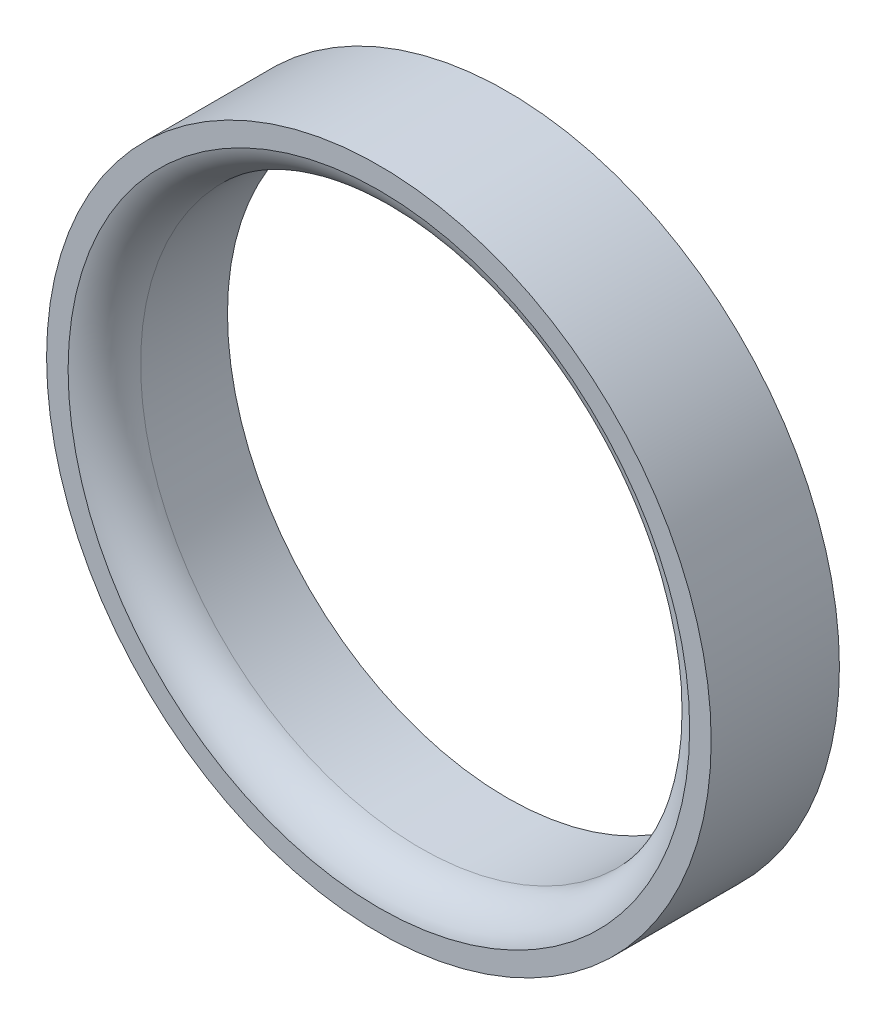
ISO-10303-21;
HEADER;
FILE_DESCRIPTION(('STEP AP214'),'2;1');
FILE_NAME('part.step','',(''),(''),'','','');
FILE_SCHEMA(('AUTOMOTIVE_DESIGN { 1 0 10303 214 1 1 1 1 }'));
ENDSEC;
DATA;
#1=APPLICATION_CONTEXT('core data for automotive mechanical design processes');
#2=APPLICATION_PROTOCOL_DEFINITION('international standard','automotive_design',2000,#1);
#3=PRODUCT_CONTEXT('',#1,'mechanical');
#4=PRODUCT('Part','Part','',(#3));
#5=PRODUCT_RELATED_PRODUCT_CATEGORY('part','',(#4));
#6=PRODUCT_DEFINITION_FORMATION('','',#4);
#7=PRODUCT_DEFINITION_CONTEXT('part definition',#1,'design');
#8=PRODUCT_DEFINITION('design','',#6,#7);
#9=PRODUCT_DEFINITION_SHAPE('','',#8);
#10=(LENGTH_UNIT() NAMED_UNIT(*) SI_UNIT(.MILLI.,.METRE.));
#11=(NAMED_UNIT(*) PLANE_ANGLE_UNIT() SI_UNIT($,.RADIAN.));
#12=(NAMED_UNIT(*) SI_UNIT($,.STERADIAN.) SOLID_ANGLE_UNIT());
#13=UNCERTAINTY_MEASURE_WITH_UNIT(LENGTH_MEASURE(1.E-05),#10,'distance_accuracy_value','');
#14=(GEOMETRIC_REPRESENTATION_CONTEXT(3) GLOBAL_UNCERTAINTY_ASSIGNED_CONTEXT((#13)) GLOBAL_UNIT_ASSIGNED_CONTEXT((#10,
#11,#12)) REPRESENTATION_CONTEXT('',''));
#15=CARTESIAN_POINT('',(0.,0.,0.));
#16=DIRECTION('',(0.,0.,1.));
#17=DIRECTION('',(1.,0.,0.));
#18=AXIS2_PLACEMENT_3D('',#15,#16,#17);
#19=CARTESIAN_POINT('',(-67.0588710528035,3.99999999999998,8.34));
#20=DIRECTION('',(0.,0.,-1.));
#21=DIRECTION('',(-1.,0.,0.));
#22=AXIS2_PLACEMENT_3D('',#19,#20,#21);
#23=CYLINDRICAL_SURFACE('',#22,7.72401356534921);
#24=CARTESIAN_POINT('',(-67.0588710528035,3.99999999999998,8.34));
#25=DIRECTION('',(0.,0.,-1.));
#26=DIRECTION('',(-1.,0.,0.));
#27=AXIS2_PLACEMENT_3D('',#24,#25,#26);
#28=CIRCLE('',#27,7.72401356534921);
#29=CARTESIAN_POINT('',(-74.7828846181527,3.99999999999998,8.34));
#30=VERTEX_POINT('',#29);
#31=EDGE_CURVE('E53',#30,#30,#28,.T.);
#32=ORIENTED_EDGE('',*,*,#31,.T.);
#33=EDGE_LOOP('',(#32));
#34=FACE_BOUND('',#33,.T.);
#35=CARTESIAN_POINT('',(-67.0588710528035,3.99999999999998,5.35947622269492));
#36=DIRECTION('',(0.,0.,-1.));
#37=DIRECTION('',(-1.,0.,0.));
#38=AXIS2_PLACEMENT_3D('',#35,#36,#37);
#39=CIRCLE('',#38,7.72401356534921);
#40=CARTESIAN_POINT('',(-74.7828846181527,3.99999999999998,5.35947622269492));
#41=VERTEX_POINT('',#40);
#42=EDGE_CURVE('E58',#41,#41,#39,.T.);
#43=ORIENTED_EDGE('',*,*,#42,.F.);
#44=EDGE_LOOP('',(#43));
#45=FACE_BOUND('',#44,.T.);
#46=ADVANCED_FACE('F41',(#34,#45),#23,.T.);
#47=CARTESIAN_POINT('',(-67.0588710528035,3.99999999999998,0.504508145896539));
#48=DIRECTION('',(0.,0.,1.));
#49=DIRECTION('',(1.,0.,0.));
#50=AXIS2_PLACEMENT_3D('',#47,#48,#49);
#51=CYLINDRICAL_SURFACE('',#50,6.5);
#52=CARTESIAN_POINT('',(-67.0588710528035,3.99999999999998,7.37883846940862));
#53=DIRECTION('',(0.,0.,1.));
#54=DIRECTION('',(1.,0.,0.));
#55=AXIS2_PLACEMENT_3D('',#52,#53,#54);
#56=CIRCLE('',#55,6.5);
#57=CARTESIAN_POINT('',(-60.5588710528035,3.99999999999998,7.37883846940862));
#58=VERTEX_POINT('',#57);
#59=EDGE_CURVE('E11',#58,#58,#56,.T.);
#60=ORIENTED_EDGE('',*,*,#59,.T.);
#61=EDGE_LOOP('',(#60));
#62=FACE_BOUND('',#61,.T.);
#63=CARTESIAN_POINT('',(-67.0588710528035,3.99999999999998,5.35947622269492));
#64=DIRECTION('',(0.,0.,-1.));
#65=DIRECTION('',(-1.,0.,0.));
#66=AXIS2_PLACEMENT_3D('',#63,#64,#65);
#67=CIRCLE('',#66,6.5);
#68=CARTESIAN_POINT('',(-73.5588710528035,3.99999999999998,5.35947622269492));
#69=VERTEX_POINT('',#68);
#70=EDGE_CURVE('E45',#69,#69,#67,.F.);
#71=ORIENTED_EDGE('',*,*,#70,.F.);
#72=EDGE_LOOP('',(#71));
#73=FACE_BOUND('',#72,.T.);
#74=ADVANCED_FACE('F67',(#62,#73),#51,.F.);
#75=CARTESIAN_POINT('',(-67.0588710528035,3.99999999999998,8.34));
#76=DIRECTION('',(0.,0.,1.));
#77=DIRECTION('',(1.,0.,0.));
#78=AXIS2_PLACEMENT_3D('',#75,#76,#77);
#79=PLANE('',#78);
#80=CARTESIAN_POINT('',(-67.0588710528035,3.99999999999998,8.34));
#81=DIRECTION('',(0.,0.,-1.));
#82=DIRECTION('',(-1.,0.,0.));
#83=AXIS2_PLACEMENT_3D('',#80,#81,#82);
#84=CIRCLE('',#83,7.22401356534922);
#85=CARTESIAN_POINT('',(-74.2828846181527,3.99999999999998,8.34));
#86=VERTEX_POINT('',#85);
#87=EDGE_CURVE('E49',#86,#86,#84,.F.);
#88=ORIENTED_EDGE('',*,*,#87,.F.);
#89=EDGE_LOOP('',(#88));
#90=FACE_BOUND('',#89,.T.);
#91=ORIENTED_EDGE('',*,*,#31,.F.);
#92=EDGE_LOOP('',(#91));
#93=FACE_BOUND('',#92,.T.);
#94=ADVANCED_FACE('F69',(#90,#93),#79,.T.);
#95=CARTESIAN_POINT('',(-67.0588710528035,3.99999999999998,7.37883846940862));
#96=DIRECTION('',(0.,0.,1.));
#97=DIRECTION('',(1.,0.,0.));
#98=AXIS2_PLACEMENT_3D('',#95,#96,#97);
#99=TOROIDAL_SURFACE('',#98,7.5,1.);
#100=ORIENTED_EDGE('',*,*,#87,.T.);
#101=EDGE_LOOP('',(#100));
#102=FACE_BOUND('',#101,.T.);
#103=ORIENTED_EDGE('',*,*,#59,.F.);
#104=EDGE_LOOP('',(#103));
#105=FACE_BOUND('',#104,.T.);
#106=ADVANCED_FACE('F43',(#102,#105),#99,.T.);
#107=CARTESIAN_POINT('',(-67.0588710528035,3.99999999999998,5.35947622269492));
#108=DIRECTION('',(0.,0.,-1.));
#109=DIRECTION('',(-1.,0.,0.));
#110=AXIS2_PLACEMENT_3D('',#107,#108,#109);
#111=PLANE('',#110);
#112=ORIENTED_EDGE('',*,*,#42,.T.);
#113=EDGE_LOOP('',(#112));
#114=FACE_BOUND('',#113,.T.);
#115=ORIENTED_EDGE('',*,*,#70,.T.);
#116=EDGE_LOOP('',(#115));
#117=FACE_BOUND('',#116,.T.);
#118=ADVANCED_FACE('F65',(#114,#117),#111,.T.);
#119=CLOSED_SHELL('',(#46,#74,#94,#106,#118));
#120=MANIFOLD_SOLID_BREP('B2',#119);
#121=ADVANCED_BREP_SHAPE_REPRESENTATION('',(#18,#120),#14);
#122=SHAPE_DEFINITION_REPRESENTATION(#9,#121);
ENDSEC;
END-ISO-10303-21;
